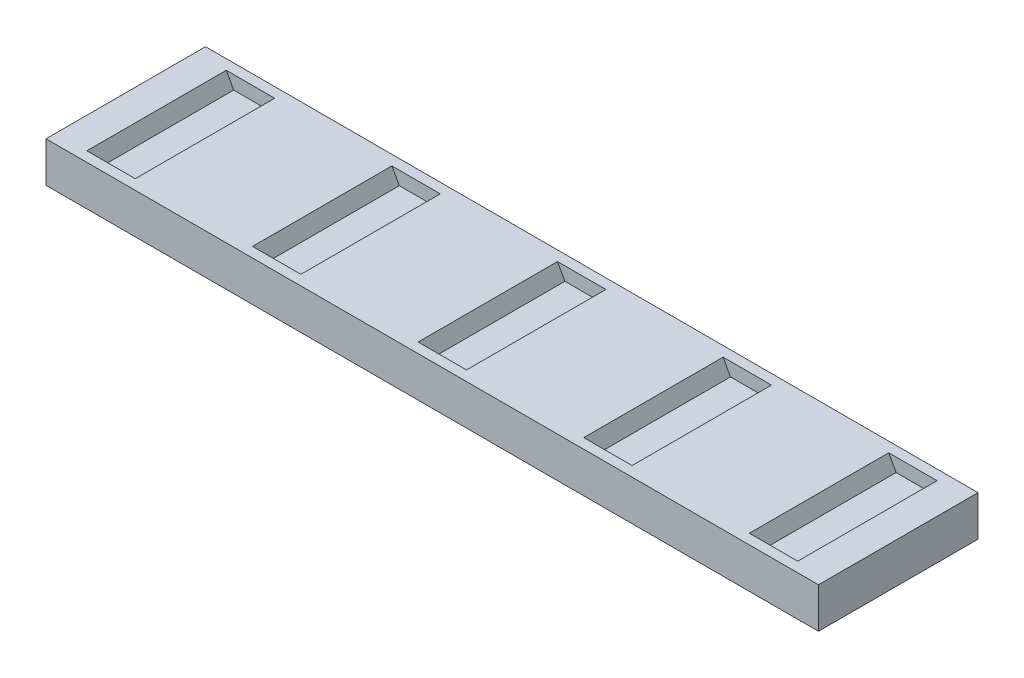
ISO-10303-21;
HEADER;
FILE_DESCRIPTION(('STEP AP214'),'2;1');
FILE_NAME('part.step','',(''),(''),'','','');
FILE_SCHEMA(('AUTOMOTIVE_DESIGN { 1 0 10303 214 1 1 1 1 }'));
ENDSEC;
DATA;
#1=APPLICATION_CONTEXT('core data for automotive mechanical design processes');
#2=APPLICATION_PROTOCOL_DEFINITION('international standard','automotive_design',2000,#1);
#3=PRODUCT_CONTEXT('',#1,'mechanical');
#4=PRODUCT('Part','Part','',(#3));
#5=PRODUCT_RELATED_PRODUCT_CATEGORY('part','',(#4));
#6=PRODUCT_DEFINITION_FORMATION('','',#4);
#7=PRODUCT_DEFINITION_CONTEXT('part definition',#1,'design');
#8=PRODUCT_DEFINITION('design','',#6,#7);
#9=PRODUCT_DEFINITION_SHAPE('','',#8);
#10=(LENGTH_UNIT() NAMED_UNIT(*) SI_UNIT(.MILLI.,.METRE.));
#11=(NAMED_UNIT(*) PLANE_ANGLE_UNIT() SI_UNIT($,.RADIAN.));
#12=(NAMED_UNIT(*) SI_UNIT($,.STERADIAN.) SOLID_ANGLE_UNIT());
#13=UNCERTAINTY_MEASURE_WITH_UNIT(LENGTH_MEASURE(1.E-05),#10,'distance_accuracy_value','');
#14=(GEOMETRIC_REPRESENTATION_CONTEXT(3) GLOBAL_UNCERTAINTY_ASSIGNED_CONTEXT((#13)) GLOBAL_UNIT_ASSIGNED_CONTEXT((#10,
#11,#12)) REPRESENTATION_CONTEXT('',''));
#15=CARTESIAN_POINT('',(0.,0.,0.));
#16=DIRECTION('',(0.,0.,1.));
#17=DIRECTION('',(1.,0.,0.));
#18=AXIS2_PLACEMENT_3D('',#15,#16,#17);
#19=CARTESIAN_POINT('',(230.,-15.,20.75));
#20=DIRECTION('',(1.,0.,0.));
#21=DIRECTION('',(0.,0.,1.));
#22=AXIS2_PLACEMENT_3D('',#19,#20,#21);
#23=PLANE('',#22);
#24=DIRECTION('',(0.,0.,1.));
#25=VECTOR('',#24,1.);
#26=CARTESIAN_POINT('',(230.,-6.,-23.75));
#27=LINE('',#26,#25);
#28=CARTESIAN_POINT('',(230.,-6.,-23.75));
#29=VERTEX_POINT('',#28);
#30=CARTESIAN_POINT('',(230.,-6.,23.75));
#31=VERTEX_POINT('',#30);
#32=EDGE_CURVE('E315',#29,#31,#27,.T.);
#33=ORIENTED_EDGE('',*,*,#32,.T.);
#34=DIRECTION('',(0.,-1.,0.));
#35=VECTOR('',#34,1.);
#36=CARTESIAN_POINT('',(230.,-15.,23.75));
#37=LINE('',#36,#35);
#38=CARTESIAN_POINT('',(230.,-18.,23.7500000000001));
#39=VERTEX_POINT('',#38);
#40=EDGE_CURVE('E338',#31,#39,#37,.T.);
#41=ORIENTED_EDGE('',*,*,#40,.T.);
#42=DIRECTION('',(0.,0.,1.));
#43=VECTOR('',#42,1.);
#44=CARTESIAN_POINT('',(230.,-18.,-23.75));
#45=LINE('',#44,#43);
#46=CARTESIAN_POINT('',(230.,-18.,-23.75));
#47=VERTEX_POINT('',#46);
#48=EDGE_CURVE('E318',#47,#39,#45,.T.);
#49=ORIENTED_EDGE('',*,*,#48,.F.);
#50=DIRECTION('',(0.,1.,0.));
#51=VECTOR('',#50,1.);
#52=CARTESIAN_POINT('',(230.,-18.,-23.75));
#53=LINE('',#52,#51);
#54=EDGE_CURVE('E329',#47,#29,#53,.T.);
#55=ORIENTED_EDGE('',*,*,#54,.T.);
#56=EDGE_LOOP('',(#33,#41,#49,#55));
#57=FACE_BOUND('',#56,.T.);
#58=ADVANCED_FACE('F37',(#57),#23,.T.);
#59=CARTESIAN_POINT('',(0.,-2.97600000000012,20.75));
#60=DIRECTION('',(-1.,0.,0.));
#61=DIRECTION('',(0.,-1.,0.));
#62=AXIS2_PLACEMENT_3D('',#59,#60,#61);
#63=PLANE('',#62);
#64=DIRECTION('',(0.,0.,1.));
#65=VECTOR('',#64,1.);
#66=CARTESIAN_POINT('',(0.,-6.,-23.75));
#67=LINE('',#66,#65);
#68=CARTESIAN_POINT('',(0.,-6.,-23.75));
#69=VERTEX_POINT('',#68);
#70=CARTESIAN_POINT('',(0.,-6.,23.75));
#71=VERTEX_POINT('',#70);
#72=EDGE_CURVE('E313',#69,#71,#67,.T.);
#73=ORIENTED_EDGE('',*,*,#72,.F.);
#74=DIRECTION('',(0.,1.,0.));
#75=VECTOR('',#74,1.);
#76=CARTESIAN_POINT('',(0.,-18.,-23.75));
#77=LINE('',#76,#75);
#78=CARTESIAN_POINT('',(0.,-18.,-23.75));
#79=VERTEX_POINT('',#78);
#80=EDGE_CURVE('E332',#79,#69,#77,.T.);
#81=ORIENTED_EDGE('',*,*,#80,.F.);
#82=DIRECTION('',(0.,0.,-1.));
#83=VECTOR('',#82,1.);
#84=CARTESIAN_POINT('',(0.,-18.,-23.75));
#85=LINE('',#84,#83);
#86=CARTESIAN_POINT('',(0.,-18.,23.75));
#87=VERTEX_POINT('',#86);
#88=EDGE_CURVE('E325',#87,#79,#85,.T.);
#89=ORIENTED_EDGE('',*,*,#88,.F.);
#90=DIRECTION('',(0.,1.,0.));
#91=VECTOR('',#90,1.);
#92=CARTESIAN_POINT('',(0.,-15.,23.75));
#93=LINE('',#92,#91);
#94=EDGE_CURVE('E335',#87,#71,#93,.T.);
#95=ORIENTED_EDGE('',*,*,#94,.T.);
#96=EDGE_LOOP('',(#73,#81,#89,#95));
#97=FACE_BOUND('',#96,.T.);
#98=ADVANCED_FACE('F408',(#97),#63,.T.);
#99=CARTESIAN_POINT('',(0.,0.,23.75));
#100=DIRECTION('',(0.,0.,1.));
#101=DIRECTION('',(-1.,0.,0.));
#102=AXIS2_PLACEMENT_3D('',#99,#100,#101);
#103=PLANE('',#102);
#104=DIRECTION('',(1.,0.,0.));
#105=VECTOR('',#104,1.);
#106=CARTESIAN_POINT('',(0.,-6.,23.75));
#107=LINE('',#106,#105);
#108=EDGE_CURVE('E226',#71,#31,#107,.T.);
#109=ORIENTED_EDGE('',*,*,#108,.F.);
#110=ORIENTED_EDGE('',*,*,#94,.F.);
#111=DIRECTION('',(-1.,0.,0.));
#112=VECTOR('',#111,1.);
#113=CARTESIAN_POINT('',(230.,-18.,23.7500000000001));
#114=LINE('',#113,#112);
#115=EDGE_CURVE('E322',#39,#87,#114,.T.);
#116=ORIENTED_EDGE('',*,*,#115,.F.);
#117=ORIENTED_EDGE('',*,*,#40,.F.);
#118=EDGE_LOOP('',(#109,#110,#116,#117));
#119=FACE_BOUND('',#118,.T.);
#120=ADVANCED_FACE('F413',(#119),#103,.T.);
#121=CARTESIAN_POINT('',(0.,-18.,0.));
#122=DIRECTION('',(0.,-1.,0.));
#123=DIRECTION('',(1.,0.,0.));
#124=AXIS2_PLACEMENT_3D('',#121,#122,#123);
#125=PLANE('',#124);
#126=ORIENTED_EDGE('',*,*,#88,.T.);
#127=DIRECTION('',(1.,0.,0.));
#128=VECTOR('',#127,1.);
#129=CARTESIAN_POINT('',(230.,-18.,-23.75));
#130=LINE('',#129,#128);
#131=EDGE_CURVE('E327',#79,#47,#130,.T.);
#132=ORIENTED_EDGE('',*,*,#131,.T.);
#133=ORIENTED_EDGE('',*,*,#48,.T.);
#134=ORIENTED_EDGE('',*,*,#115,.T.);
#135=EDGE_LOOP('',(#126,#132,#133,#134));
#136=FACE_BOUND('',#135,.T.);
#137=ADVANCED_FACE('F424',(#136),#125,.T.);
#138=CARTESIAN_POINT('',(230.,-18.,-23.75));
#139=DIRECTION('',(0.,0.,1.));
#140=DIRECTION('',(1.,0.,0.));
#141=AXIS2_PLACEMENT_3D('',#138,#139,#140);
#142=PLANE('',#141);
#143=ORIENTED_EDGE('',*,*,#80,.T.);
#144=DIRECTION('',(1.,0.,0.));
#145=VECTOR('',#144,1.);
#146=CARTESIAN_POINT('',(0.,-6.,-23.75));
#147=LINE('',#146,#145);
#148=EDGE_CURVE('E310',#69,#29,#147,.T.);
#149=ORIENTED_EDGE('',*,*,#148,.T.);
#150=ORIENTED_EDGE('',*,*,#54,.F.);
#151=ORIENTED_EDGE('',*,*,#131,.F.);
#152=EDGE_LOOP('',(#143,#149,#150,#151));
#153=FACE_BOUND('',#152,.T.);
#154=ADVANCED_FACE('F429',(#153),#142,.F.);
#155=CARTESIAN_POINT('',(0.,-6.,-23.75));
#156=DIRECTION('',(0.,-1.,0.));
#157=DIRECTION('',(0.,0.,-1.));
#158=AXIS2_PLACEMENT_3D('',#155,#156,#157);
#159=PLANE('',#158);
#160=DIRECTION('',(0.,0.,-1.));
#161=VECTOR('',#160,1.);
#162=CARTESIAN_POINT('',(9.18000000000008,-6.,-23.75));
#163=LINE('',#162,#161);
#164=CARTESIAN_POINT('',(9.18000000000008,-6.,20.75));
#165=VERTEX_POINT('',#164);
#166=CARTESIAN_POINT('',(9.18000000000008,-6.,-20.75));
#167=VERTEX_POINT('',#166);
#168=EDGE_CURVE('E44',#165,#167,#163,.T.);
#169=ORIENTED_EDGE('',*,*,#168,.T.);
#170=DIRECTION('',(1.,0.,0.));
#171=VECTOR('',#170,1.);
#172=CARTESIAN_POINT('',(0.,-6.,-20.75));
#173=LINE('',#172,#171);
#174=CARTESIAN_POINT('',(23.58,-6.,-20.75));
#175=VERTEX_POINT('',#174);
#176=EDGE_CURVE('E12',#167,#175,#173,.T.);
#177=ORIENTED_EDGE('',*,*,#176,.T.);
#178=DIRECTION('',(0.,0.,1.));
#179=VECTOR('',#178,1.);
#180=CARTESIAN_POINT('',(23.58,-6.,-23.75));
#181=LINE('',#180,#179);
#182=CARTESIAN_POINT('',(23.58,-6.,20.75));
#183=VERTEX_POINT('',#182);
#184=EDGE_CURVE('E386',#175,#183,#181,.T.);
#185=ORIENTED_EDGE('',*,*,#184,.T.);
#186=DIRECTION('',(1.,0.,0.));
#187=VECTOR('',#186,1.);
#188=CARTESIAN_POINT('',(0.,-6.,20.75));
#189=LINE('',#188,#187);
#190=EDGE_CURVE('E384',#165,#183,#189,.T.);
#191=ORIENTED_EDGE('',*,*,#190,.F.);
#192=EDGE_LOOP('',(#169,#177,#185,#191));
#193=FACE_BOUND('',#192,.T.);
#194=DIRECTION('',(0.,0.,-1.));
#195=VECTOR('',#194,1.);
#196=CARTESIAN_POINT('',(58.4900000000001,-6.,-23.75));
#197=LINE('',#196,#195);
#198=CARTESIAN_POINT('',(58.4900000000001,-6.,20.75));
#199=VERTEX_POINT('',#198);
#200=CARTESIAN_POINT('',(58.4900000000001,-6.,-20.75));
#201=VERTEX_POINT('',#200);
#202=EDGE_CURVE('E378',#199,#201,#197,.T.);
#203=ORIENTED_EDGE('',*,*,#202,.T.);
#204=DIRECTION('',(1.,0.,0.));
#205=VECTOR('',#204,1.);
#206=CARTESIAN_POINT('',(0.,-6.,-20.75));
#207=LINE('',#206,#205);
#208=CARTESIAN_POINT('',(72.8900000000001,-6.,-20.75));
#209=VERTEX_POINT('',#208);
#210=EDGE_CURVE('E381',#201,#209,#207,.T.);
#211=ORIENTED_EDGE('',*,*,#210,.T.);
#212=DIRECTION('',(0.,0.,1.));
#213=VECTOR('',#212,1.);
#214=CARTESIAN_POINT('',(72.8900000000001,-6.,-23.75));
#215=LINE('',#214,#213);
#216=CARTESIAN_POINT('',(72.8900000000001,-6.,20.75));
#217=VERTEX_POINT('',#216);
#218=EDGE_CURVE('E375',#209,#217,#215,.T.);
#219=ORIENTED_EDGE('',*,*,#218,.T.);
#220=DIRECTION('',(1.,0.,0.));
#221=VECTOR('',#220,1.);
#222=CARTESIAN_POINT('',(0.,-6.,20.75));
#223=LINE('',#222,#221);
#224=EDGE_CURVE('E373',#199,#217,#223,.T.);
#225=ORIENTED_EDGE('',*,*,#224,.F.);
#226=EDGE_LOOP('',(#203,#211,#219,#225));
#227=FACE_BOUND('',#226,.T.);
#228=DIRECTION('',(0.,0.,-1.));
#229=VECTOR('',#228,1.);
#230=CARTESIAN_POINT('',(107.8,-6.,-23.75));
#231=LINE('',#230,#229);
#232=CARTESIAN_POINT('',(107.8,-6.,20.75));
#233=VERTEX_POINT('',#232);
#234=CARTESIAN_POINT('',(107.8,-6.,-20.75));
#235=VERTEX_POINT('',#234);
#236=EDGE_CURVE('E367',#233,#235,#231,.T.);
#237=ORIENTED_EDGE('',*,*,#236,.T.);
#238=DIRECTION('',(1.,0.,0.));
#239=VECTOR('',#238,1.);
#240=CARTESIAN_POINT('',(0.,-6.,-20.75));
#241=LINE('',#240,#239);
#242=CARTESIAN_POINT('',(122.2,-6.,-20.75));
#243=VERTEX_POINT('',#242);
#244=EDGE_CURVE('E370',#235,#243,#241,.T.);
#245=ORIENTED_EDGE('',*,*,#244,.T.);
#246=DIRECTION('',(0.,0.,1.));
#247=VECTOR('',#246,1.);
#248=CARTESIAN_POINT('',(122.2,-6.,-23.75));
#249=LINE('',#248,#247);
#250=CARTESIAN_POINT('',(122.2,-6.,20.75));
#251=VERTEX_POINT('',#250);
#252=EDGE_CURVE('E364',#243,#251,#249,.T.);
#253=ORIENTED_EDGE('',*,*,#252,.T.);
#254=DIRECTION('',(1.,0.,0.));
#255=VECTOR('',#254,1.);
#256=CARTESIAN_POINT('',(0.,-6.,20.75));
#257=LINE('',#256,#255);
#258=EDGE_CURVE('E362',#233,#251,#257,.T.);
#259=ORIENTED_EDGE('',*,*,#258,.F.);
#260=EDGE_LOOP('',(#237,#245,#253,#259));
#261=FACE_BOUND('',#260,.T.);
#262=DIRECTION('',(0.,0.,-1.));
#263=VECTOR('',#262,1.);
#264=CARTESIAN_POINT('',(157.11,-6.,-23.75));
#265=LINE('',#264,#263);
#266=CARTESIAN_POINT('',(157.11,-6.,20.75));
#267=VERTEX_POINT('',#266);
#268=CARTESIAN_POINT('',(157.11,-6.,-20.75));
#269=VERTEX_POINT('',#268);
#270=EDGE_CURVE('E356',#267,#269,#265,.T.);
#271=ORIENTED_EDGE('',*,*,#270,.T.);
#272=DIRECTION('',(1.,0.,0.));
#273=VECTOR('',#272,1.);
#274=CARTESIAN_POINT('',(0.,-6.,-20.75));
#275=LINE('',#274,#273);
#276=CARTESIAN_POINT('',(171.51,-6.,-20.75));
#277=VERTEX_POINT('',#276);
#278=EDGE_CURVE('E359',#269,#277,#275,.T.);
#279=ORIENTED_EDGE('',*,*,#278,.T.);
#280=DIRECTION('',(0.,0.,1.));
#281=VECTOR('',#280,1.);
#282=CARTESIAN_POINT('',(171.51,-6.,-23.75));
#283=LINE('',#282,#281);
#284=CARTESIAN_POINT('',(171.51,-6.,20.75));
#285=VERTEX_POINT('',#284);
#286=EDGE_CURVE('E353',#277,#285,#283,.T.);
#287=ORIENTED_EDGE('',*,*,#286,.T.);
#288=DIRECTION('',(1.,0.,0.));
#289=VECTOR('',#288,1.);
#290=CARTESIAN_POINT('',(0.,-6.,20.75));
#291=LINE('',#290,#289);
#292=EDGE_CURVE('E351',#267,#285,#291,.T.);
#293=ORIENTED_EDGE('',*,*,#292,.F.);
#294=EDGE_LOOP('',(#271,#279,#287,#293));
#295=FACE_BOUND('',#294,.T.);
#296=DIRECTION('',(0.,0.,-1.));
#297=VECTOR('',#296,1.);
#298=CARTESIAN_POINT('',(206.42,-6.,-23.75));
#299=LINE('',#298,#297);
#300=CARTESIAN_POINT('',(206.42,-6.,20.75));
#301=VERTEX_POINT('',#300);
#302=CARTESIAN_POINT('',(206.42,-6.,-20.75));
#303=VERTEX_POINT('',#302);
#304=EDGE_CURVE('E345',#301,#303,#299,.T.);
#305=ORIENTED_EDGE('',*,*,#304,.T.);
#306=DIRECTION('',(1.,0.,0.));
#307=VECTOR('',#306,1.);
#308=CARTESIAN_POINT('',(0.,-6.,-20.75));
#309=LINE('',#308,#307);
#310=CARTESIAN_POINT('',(220.82,-6.,-20.75));
#311=VERTEX_POINT('',#310);
#312=EDGE_CURVE('E348',#303,#311,#309,.T.);
#313=ORIENTED_EDGE('',*,*,#312,.T.);
#314=DIRECTION('',(0.,0.,1.));
#315=VECTOR('',#314,1.);
#316=CARTESIAN_POINT('',(220.82,-6.,-23.75));
#317=LINE('',#316,#315);
#318=CARTESIAN_POINT('',(220.82,-6.,20.75));
#319=VERTEX_POINT('',#318);
#320=EDGE_CURVE('E342',#311,#319,#317,.T.);
#321=ORIENTED_EDGE('',*,*,#320,.T.);
#322=DIRECTION('',(1.,0.,0.));
#323=VECTOR('',#322,1.);
#324=CARTESIAN_POINT('',(0.,-6.,20.75));
#325=LINE('',#324,#323);
#326=EDGE_CURVE('E340',#301,#319,#325,.T.);
#327=ORIENTED_EDGE('',*,*,#326,.F.);
#328=EDGE_LOOP('',(#305,#313,#321,#327));
#329=FACE_BOUND('',#328,.T.);
#330=ORIENTED_EDGE('',*,*,#108,.T.);
#331=ORIENTED_EDGE('',*,*,#32,.F.);
#332=ORIENTED_EDGE('',*,*,#148,.F.);
#333=ORIENTED_EDGE('',*,*,#72,.T.);
#334=EDGE_LOOP('',(#330,#331,#332,#333));
#335=FACE_BOUND('',#334,.T.);
#336=ADVANCED_FACE('F390',(#193,#227,#261,#295,#329,#335),#159,.F.);
#337=CARTESIAN_POINT('',(208.62,-9.99999999999997,-20.75));
#338=DIRECTION('',(-0.876215908676647,-0.481918749772156,0.));
#339=DIRECTION('',(0.481918749772156,-0.876215908676647,0.));
#340=AXIS2_PLACEMENT_3D('',#337,#338,#339);
#341=PLANE('',#340);
#342=DIRECTION('',(0.481918749772156,-0.876215908676647,0.));
#343=VECTOR('',#342,1.);
#344=CARTESIAN_POINT('',(208.62,-9.99999999999997,20.75));
#345=LINE('',#344,#343);
#346=CARTESIAN_POINT('',(208.62,-9.99999999999997,20.75));
#347=VERTEX_POINT('',#346);
#348=EDGE_CURVE('E300',#301,#347,#345,.T.);
#349=ORIENTED_EDGE('',*,*,#348,.T.);
#350=DIRECTION('',(0.,0.,1.));
#351=VECTOR('',#350,1.);
#352=CARTESIAN_POINT('',(208.62,-9.99999999999997,-20.75));
#353=LINE('',#352,#351);
#354=CARTESIAN_POINT('',(208.62,-9.99999999999997,-20.75));
#355=VERTEX_POINT('',#354);
#356=EDGE_CURVE('E299',#355,#347,#353,.T.);
#357=ORIENTED_EDGE('',*,*,#356,.F.);
#358=DIRECTION('',(0.481918749772156,-0.876215908676647,0.));
#359=VECTOR('',#358,1.);
#360=CARTESIAN_POINT('',(208.62,-9.99999999999997,-20.75));
#361=LINE('',#360,#359);
#362=EDGE_CURVE('E290',#303,#355,#361,.T.);
#363=ORIENTED_EDGE('',*,*,#362,.F.);
#364=ORIENTED_EDGE('',*,*,#304,.F.);
#365=EDGE_LOOP('',(#349,#357,#363,#364));
#366=FACE_BOUND('',#365,.T.);
#367=ADVANCED_FACE('F431',(#366),#341,.F.);
#368=CARTESIAN_POINT('',(224.12,0.,-20.75));
#369=DIRECTION('',(0.876215908676647,-0.481918749772156,0.));
#370=DIRECTION('',(0.481918749772156,0.876215908676647,0.));
#371=AXIS2_PLACEMENT_3D('',#368,#369,#370);
#372=PLANE('',#371);
#373=DIRECTION('',(0.481918749772156,0.876215908676647,0.));
#374=VECTOR('',#373,1.);
#375=CARTESIAN_POINT('',(224.12,0.,-20.75));
#376=LINE('',#375,#374);
#377=CARTESIAN_POINT('',(218.62,-9.99999999999997,-20.75));
#378=VERTEX_POINT('',#377);
#379=EDGE_CURVE('E296',#378,#311,#376,.T.);
#380=ORIENTED_EDGE('',*,*,#379,.F.);
#381=DIRECTION('',(0.,0.,1.));
#382=VECTOR('',#381,1.);
#383=CARTESIAN_POINT('',(218.62,-9.99999999999997,-20.75));
#384=LINE('',#383,#382);
#385=CARTESIAN_POINT('',(218.62,-9.99999999999997,20.75));
#386=VERTEX_POINT('',#385);
#387=EDGE_CURVE('E282',#378,#386,#384,.T.);
#388=ORIENTED_EDGE('',*,*,#387,.T.);
#389=DIRECTION('',(0.481918749772156,0.876215908676647,0.));
#390=VECTOR('',#389,1.);
#391=CARTESIAN_POINT('',(224.12,0.,20.75));
#392=LINE('',#391,#390);
#393=EDGE_CURVE('E293',#386,#319,#392,.T.);
#394=ORIENTED_EDGE('',*,*,#393,.T.);
#395=ORIENTED_EDGE('',*,*,#320,.F.);
#396=EDGE_LOOP('',(#380,#388,#394,#395));
#397=FACE_BOUND('',#396,.T.);
#398=ADVANCED_FACE('F437',(#397),#372,.F.);
#399=CARTESIAN_POINT('',(0.,0.,-20.75));
#400=DIRECTION('',(0.,0.,-1.));
#401=DIRECTION('',(-1.,0.,0.));
#402=AXIS2_PLACEMENT_3D('',#399,#400,#401);
#403=PLANE('',#402);
#404=ORIENTED_EDGE('',*,*,#362,.T.);
#405=DIRECTION('',(1.,0.,0.));
#406=VECTOR('',#405,1.);
#407=CARTESIAN_POINT('',(218.62,-9.99999999999997,-20.75));
#408=LINE('',#407,#406);
#409=EDGE_CURVE('E292',#355,#378,#408,.T.);
#410=ORIENTED_EDGE('',*,*,#409,.T.);
#411=ORIENTED_EDGE('',*,*,#379,.T.);
#412=ORIENTED_EDGE('',*,*,#312,.F.);
#413=EDGE_LOOP('',(#404,#410,#411,#412));
#414=FACE_BOUND('',#413,.T.);
#415=ADVANCED_FACE('F479',(#414),#403,.F.);
#416=CARTESIAN_POINT('',(0.,0.,20.75));
#417=DIRECTION('',(0.,0.,-1.));
#418=DIRECTION('',(-1.,0.,0.));
#419=AXIS2_PLACEMENT_3D('',#416,#417,#418);
#420=PLANE('',#419);
#421=ORIENTED_EDGE('',*,*,#326,.T.);
#422=ORIENTED_EDGE('',*,*,#393,.F.);
#423=DIRECTION('',(1.,0.,0.));
#424=VECTOR('',#423,1.);
#425=CARTESIAN_POINT('',(218.62,-9.99999999999997,20.75));
#426=LINE('',#425,#424);
#427=EDGE_CURVE('E302',#347,#386,#426,.T.);
#428=ORIENTED_EDGE('',*,*,#427,.F.);
#429=ORIENTED_EDGE('',*,*,#348,.F.);
#430=EDGE_LOOP('',(#421,#422,#428,#429));
#431=FACE_BOUND('',#430,.T.);
#432=ADVANCED_FACE('F489',(#431),#420,.T.);
#433=CARTESIAN_POINT('',(218.62,-9.99999999999997,-20.75));
#434=DIRECTION('',(0.,-1.,0.));
#435=DIRECTION('',(0.,0.,-1.));
#436=AXIS2_PLACEMENT_3D('',#433,#434,#435);
#437=PLANE('',#436);
#438=ORIENTED_EDGE('',*,*,#427,.T.);
#439=ORIENTED_EDGE('',*,*,#387,.F.);
#440=ORIENTED_EDGE('',*,*,#409,.F.);
#441=ORIENTED_EDGE('',*,*,#356,.T.);
#442=EDGE_LOOP('',(#438,#439,#440,#441));
#443=FACE_BOUND('',#442,.T.);
#444=ADVANCED_FACE('F499',(#443),#437,.F.);
#445=CARTESIAN_POINT('',(159.31,-9.99999999999997,-20.75));
#446=DIRECTION('',(-0.876215908676647,-0.481918749772156,0.));
#447=DIRECTION('',(0.481918749772156,-0.876215908676647,0.));
#448=AXIS2_PLACEMENT_3D('',#445,#446,#447);
#449=PLANE('',#448);
#450=DIRECTION('',(0.481918749772156,-0.876215908676647,0.));
#451=VECTOR('',#450,1.);
#452=CARTESIAN_POINT('',(159.31,-9.99999999999997,20.75));
#453=LINE('',#452,#451);
#454=CARTESIAN_POINT('',(159.31,-9.99999999999997,20.75));
#455=VERTEX_POINT('',#454);
#456=EDGE_CURVE('E279',#267,#455,#453,.T.);
#457=ORIENTED_EDGE('',*,*,#456,.T.);
#458=DIRECTION('',(0.,0.,1.));
#459=VECTOR('',#458,1.);
#460=CARTESIAN_POINT('',(159.31,-9.99999999999997,-20.75));
#461=LINE('',#460,#459);
#462=CARTESIAN_POINT('',(159.31,-9.99999999999997,-20.75));
#463=VERTEX_POINT('',#462);
#464=EDGE_CURVE('E278',#463,#455,#461,.T.);
#465=ORIENTED_EDGE('',*,*,#464,.F.);
#466=DIRECTION('',(0.481918749772156,-0.876215908676647,0.));
#467=VECTOR('',#466,1.);
#468=CARTESIAN_POINT('',(159.31,-9.99999999999997,-20.75));
#469=LINE('',#468,#467);
#470=EDGE_CURVE('E269',#269,#463,#469,.T.);
#471=ORIENTED_EDGE('',*,*,#470,.F.);
#472=ORIENTED_EDGE('',*,*,#270,.F.);
#473=EDGE_LOOP('',(#457,#465,#471,#472));
#474=FACE_BOUND('',#473,.T.);
#475=ADVANCED_FACE('F509',(#474),#449,.F.);
#476=CARTESIAN_POINT('',(174.81,0.,-20.75));
#477=DIRECTION('',(0.876215908676647,-0.481918749772156,0.));
#478=DIRECTION('',(0.481918749772156,0.876215908676647,0.));
#479=AXIS2_PLACEMENT_3D('',#476,#477,#478);
#480=PLANE('',#479);
#481=DIRECTION('',(0.481918749772156,0.876215908676647,0.));
#482=VECTOR('',#481,1.);
#483=CARTESIAN_POINT('',(174.81,0.,-20.75));
#484=LINE('',#483,#482);
#485=CARTESIAN_POINT('',(169.31,-9.99999999999997,-20.75));
#486=VERTEX_POINT('',#485);
#487=EDGE_CURVE('E275',#486,#277,#484,.T.);
#488=ORIENTED_EDGE('',*,*,#487,.F.);
#489=DIRECTION('',(0.,0.,1.));
#490=VECTOR('',#489,1.);
#491=CARTESIAN_POINT('',(169.31,-9.99999999999997,-20.75));
#492=LINE('',#491,#490);
#493=CARTESIAN_POINT('',(169.31,-9.99999999999997,20.75));
#494=VERTEX_POINT('',#493);
#495=EDGE_CURVE('E261',#486,#494,#492,.T.);
#496=ORIENTED_EDGE('',*,*,#495,.T.);
#497=DIRECTION('',(0.481918749772156,0.876215908676647,0.));
#498=VECTOR('',#497,1.);
#499=CARTESIAN_POINT('',(174.81,0.,20.75));
#500=LINE('',#499,#498);
#501=EDGE_CURVE('E272',#494,#285,#500,.T.);
#502=ORIENTED_EDGE('',*,*,#501,.T.);
#503=ORIENTED_EDGE('',*,*,#286,.F.);
#504=EDGE_LOOP('',(#488,#496,#502,#503));
#505=FACE_BOUND('',#504,.T.);
#506=ADVANCED_FACE('F518',(#505),#480,.F.);
#507=CARTESIAN_POINT('',(0.,0.,-20.75));
#508=DIRECTION('',(0.,0.,-1.));
#509=DIRECTION('',(-1.,0.,0.));
#510=AXIS2_PLACEMENT_3D('',#507,#508,#509);
#511=PLANE('',#510);
#512=ORIENTED_EDGE('',*,*,#470,.T.);
#513=DIRECTION('',(1.,0.,0.));
#514=VECTOR('',#513,1.);
#515=CARTESIAN_POINT('',(169.31,-9.99999999999997,-20.75));
#516=LINE('',#515,#514);
#517=EDGE_CURVE('E271',#463,#486,#516,.T.);
#518=ORIENTED_EDGE('',*,*,#517,.T.);
#519=ORIENTED_EDGE('',*,*,#487,.T.);
#520=ORIENTED_EDGE('',*,*,#278,.F.);
#521=EDGE_LOOP('',(#512,#518,#519,#520));
#522=FACE_BOUND('',#521,.T.);
#523=ADVANCED_FACE('F528',(#522),#511,.F.);
#524=CARTESIAN_POINT('',(0.,0.,20.75));
#525=DIRECTION('',(0.,0.,-1.));
#526=DIRECTION('',(-1.,0.,0.));
#527=AXIS2_PLACEMENT_3D('',#524,#525,#526);
#528=PLANE('',#527);
#529=ORIENTED_EDGE('',*,*,#292,.T.);
#530=ORIENTED_EDGE('',*,*,#501,.F.);
#531=DIRECTION('',(1.,0.,0.));
#532=VECTOR('',#531,1.);
#533=CARTESIAN_POINT('',(169.31,-9.99999999999997,20.75));
#534=LINE('',#533,#532);
#535=EDGE_CURVE('E281',#455,#494,#534,.T.);
#536=ORIENTED_EDGE('',*,*,#535,.F.);
#537=ORIENTED_EDGE('',*,*,#456,.F.);
#538=EDGE_LOOP('',(#529,#530,#536,#537));
#539=FACE_BOUND('',#538,.T.);
#540=ADVANCED_FACE('F538',(#539),#528,.T.);
#541=CARTESIAN_POINT('',(169.31,-9.99999999999997,-20.75));
#542=DIRECTION('',(0.,-1.,0.));
#543=DIRECTION('',(0.,0.,-1.));
#544=AXIS2_PLACEMENT_3D('',#541,#542,#543);
#545=PLANE('',#544);
#546=ORIENTED_EDGE('',*,*,#535,.T.);
#547=ORIENTED_EDGE('',*,*,#495,.F.);
#548=ORIENTED_EDGE('',*,*,#517,.F.);
#549=ORIENTED_EDGE('',*,*,#464,.T.);
#550=EDGE_LOOP('',(#546,#547,#548,#549));
#551=FACE_BOUND('',#550,.T.);
#552=ADVANCED_FACE('F548',(#551),#545,.F.);
#553=CARTESIAN_POINT('',(110.,-9.99999999999997,-20.75));
#554=DIRECTION('',(-0.876215908676647,-0.481918749772155,0.));
#555=DIRECTION('',(0.481918749772155,-0.876215908676647,0.));
#556=AXIS2_PLACEMENT_3D('',#553,#554,#555);
#557=PLANE('',#556);
#558=DIRECTION('',(0.481918749772155,-0.876215908676647,0.));
#559=VECTOR('',#558,1.);
#560=CARTESIAN_POINT('',(110.,-9.99999999999997,20.75));
#561=LINE('',#560,#559);
#562=CARTESIAN_POINT('',(110.,-9.99999999999997,20.75));
#563=VERTEX_POINT('',#562);
#564=EDGE_CURVE('E258',#233,#563,#561,.T.);
#565=ORIENTED_EDGE('',*,*,#564,.T.);
#566=DIRECTION('',(0.,0.,1.));
#567=VECTOR('',#566,1.);
#568=CARTESIAN_POINT('',(110.,-9.99999999999997,-20.75));
#569=LINE('',#568,#567);
#570=CARTESIAN_POINT('',(110.,-9.99999999999997,-20.75));
#571=VERTEX_POINT('',#570);
#572=EDGE_CURVE('E257',#571,#563,#569,.T.);
#573=ORIENTED_EDGE('',*,*,#572,.F.);
#574=DIRECTION('',(0.481918749772155,-0.876215908676647,0.));
#575=VECTOR('',#574,1.);
#576=CARTESIAN_POINT('',(110.,-9.99999999999997,-20.75));
#577=LINE('',#576,#575);
#578=EDGE_CURVE('E248',#235,#571,#577,.T.);
#579=ORIENTED_EDGE('',*,*,#578,.F.);
#580=ORIENTED_EDGE('',*,*,#236,.F.);
#581=EDGE_LOOP('',(#565,#573,#579,#580));
#582=FACE_BOUND('',#581,.T.);
#583=ADVANCED_FACE('F558',(#582),#557,.F.);
#584=CARTESIAN_POINT('',(125.5,0.,-20.75));
#585=DIRECTION('',(0.876215908676647,-0.481918749772156,0.));
#586=DIRECTION('',(0.481918749772156,0.876215908676647,0.));
#587=AXIS2_PLACEMENT_3D('',#584,#585,#586);
#588=PLANE('',#587);
#589=DIRECTION('',(0.481918749772156,0.876215908676647,0.));
#590=VECTOR('',#589,1.);
#591=CARTESIAN_POINT('',(125.5,0.,-20.75));
#592=LINE('',#591,#590);
#593=CARTESIAN_POINT('',(120.,-9.99999999999997,-20.75));
#594=VERTEX_POINT('',#593);
#595=EDGE_CURVE('E254',#594,#243,#592,.T.);
#596=ORIENTED_EDGE('',*,*,#595,.F.);
#597=DIRECTION('',(0.,0.,1.));
#598=VECTOR('',#597,1.);
#599=CARTESIAN_POINT('',(120.,-9.99999999999997,-20.75));
#600=LINE('',#599,#598);
#601=CARTESIAN_POINT('',(120.,-9.99999999999997,20.75));
#602=VERTEX_POINT('',#601);
#603=EDGE_CURVE('E240',#594,#602,#600,.T.);
#604=ORIENTED_EDGE('',*,*,#603,.T.);
#605=DIRECTION('',(0.481918749772156,0.876215908676647,0.));
#606=VECTOR('',#605,1.);
#607=CARTESIAN_POINT('',(125.5,0.,20.75));
#608=LINE('',#607,#606);
#609=EDGE_CURVE('E251',#602,#251,#608,.T.);
#610=ORIENTED_EDGE('',*,*,#609,.T.);
#611=ORIENTED_EDGE('',*,*,#252,.F.);
#612=EDGE_LOOP('',(#596,#604,#610,#611));
#613=FACE_BOUND('',#612,.T.);
#614=ADVANCED_FACE('F568',(#613),#588,.F.);
#615=CARTESIAN_POINT('',(0.,0.,-20.75));
#616=DIRECTION('',(0.,0.,-1.));
#617=DIRECTION('',(-1.,0.,0.));
#618=AXIS2_PLACEMENT_3D('',#615,#616,#617);
#619=PLANE('',#618);
#620=ORIENTED_EDGE('',*,*,#578,.T.);
#621=DIRECTION('',(1.,0.,0.));
#622=VECTOR('',#621,1.);
#623=CARTESIAN_POINT('',(120.,-9.99999999999997,-20.75));
#624=LINE('',#623,#622);
#625=EDGE_CURVE('E250',#571,#594,#624,.T.);
#626=ORIENTED_EDGE('',*,*,#625,.T.);
#627=ORIENTED_EDGE('',*,*,#595,.T.);
#628=ORIENTED_EDGE('',*,*,#244,.F.);
#629=EDGE_LOOP('',(#620,#626,#627,#628));
#630=FACE_BOUND('',#629,.T.);
#631=ADVANCED_FACE('F578',(#630),#619,.F.);
#632=CARTESIAN_POINT('',(0.,0.,20.75));
#633=DIRECTION('',(0.,0.,-1.));
#634=DIRECTION('',(-1.,0.,0.));
#635=AXIS2_PLACEMENT_3D('',#632,#633,#634);
#636=PLANE('',#635);
#637=ORIENTED_EDGE('',*,*,#258,.T.);
#638=ORIENTED_EDGE('',*,*,#609,.F.);
#639=DIRECTION('',(1.,0.,0.));
#640=VECTOR('',#639,1.);
#641=CARTESIAN_POINT('',(120.,-9.99999999999997,20.75));
#642=LINE('',#641,#640);
#643=EDGE_CURVE('E260',#563,#602,#642,.T.);
#644=ORIENTED_EDGE('',*,*,#643,.F.);
#645=ORIENTED_EDGE('',*,*,#564,.F.);
#646=EDGE_LOOP('',(#637,#638,#644,#645));
#647=FACE_BOUND('',#646,.T.);
#648=ADVANCED_FACE('F588',(#647),#636,.T.);
#649=CARTESIAN_POINT('',(120.,-9.99999999999997,-20.75));
#650=DIRECTION('',(0.,-1.,0.));
#651=DIRECTION('',(0.,0.,-1.));
#652=AXIS2_PLACEMENT_3D('',#649,#650,#651);
#653=PLANE('',#652);
#654=ORIENTED_EDGE('',*,*,#643,.T.);
#655=ORIENTED_EDGE('',*,*,#603,.F.);
#656=ORIENTED_EDGE('',*,*,#625,.F.);
#657=ORIENTED_EDGE('',*,*,#572,.T.);
#658=EDGE_LOOP('',(#654,#655,#656,#657));
#659=FACE_BOUND('',#658,.T.);
#660=ADVANCED_FACE('F598',(#659),#653,.F.);
#661=CARTESIAN_POINT('',(60.6900000000001,-9.99999999999997,-20.75));
#662=DIRECTION('',(-0.876215908676647,-0.481918749772156,0.));
#663=DIRECTION('',(0.481918749772156,-0.876215908676647,0.));
#664=AXIS2_PLACEMENT_3D('',#661,#662,#663);
#665=PLANE('',#664);
#666=DIRECTION('',(0.481918749772156,-0.876215908676647,0.));
#667=VECTOR('',#666,1.);
#668=CARTESIAN_POINT('',(60.6900000000001,-9.99999999999997,20.75));
#669=LINE('',#668,#667);
#670=CARTESIAN_POINT('',(60.6900000000001,-9.99999999999997,20.75));
#671=VERTEX_POINT('',#670);
#672=EDGE_CURVE('E59',#199,#671,#669,.T.);
#673=ORIENTED_EDGE('',*,*,#672,.T.);
#674=DIRECTION('',(0.,0.,1.));
#675=VECTOR('',#674,1.);
#676=CARTESIAN_POINT('',(60.6900000000001,-9.99999999999997,-20.75));
#677=LINE('',#676,#675);
#678=CARTESIAN_POINT('',(60.6900000000001,-9.99999999999997,-20.75));
#679=VERTEX_POINT('',#678);
#680=EDGE_CURVE('E237',#679,#671,#677,.T.);
#681=ORIENTED_EDGE('',*,*,#680,.F.);
#682=DIRECTION('',(0.481918749772156,-0.876215908676647,0.));
#683=VECTOR('',#682,1.);
#684=CARTESIAN_POINT('',(60.6900000000001,-9.99999999999997,-20.75));
#685=LINE('',#684,#683);
#686=EDGE_CURVE('E228',#201,#679,#685,.T.);
#687=ORIENTED_EDGE('',*,*,#686,.F.);
#688=ORIENTED_EDGE('',*,*,#202,.F.);
#689=EDGE_LOOP('',(#673,#681,#687,#688));
#690=FACE_BOUND('',#689,.T.);
#691=ADVANCED_FACE('F608',(#690),#665,.F.);
#692=CARTESIAN_POINT('',(76.1900000000001,0.,-20.75));
#693=DIRECTION('',(0.876215908676647,-0.481918749772155,0.));
#694=DIRECTION('',(0.481918749772155,0.876215908676647,0.));
#695=AXIS2_PLACEMENT_3D('',#692,#693,#694);
#696=PLANE('',#695);
#697=DIRECTION('',(0.481918749772155,0.876215908676647,0.));
#698=VECTOR('',#697,1.);
#699=CARTESIAN_POINT('',(76.1900000000001,0.,-20.75));
#700=LINE('',#699,#698);
#701=CARTESIAN_POINT('',(70.6900000000001,-9.99999999999997,-20.75));
#702=VERTEX_POINT('',#701);
#703=EDGE_CURVE('E234',#702,#209,#700,.T.);
#704=ORIENTED_EDGE('',*,*,#703,.F.);
#705=DIRECTION('',(0.,0.,1.));
#706=VECTOR('',#705,1.);
#707=CARTESIAN_POINT('',(70.6900000000001,-9.99999999999997,-20.75));
#708=LINE('',#707,#706);
#709=CARTESIAN_POINT('',(70.6900000000001,-9.99999999999997,20.75));
#710=VERTEX_POINT('',#709);
#711=EDGE_CURVE('E222',#702,#710,#708,.T.);
#712=ORIENTED_EDGE('',*,*,#711,.T.);
#713=DIRECTION('',(0.481918749772155,0.876215908676647,0.));
#714=VECTOR('',#713,1.);
#715=CARTESIAN_POINT('',(76.1900000000001,0.,20.75));
#716=LINE('',#715,#714);
#717=EDGE_CURVE('E231',#710,#217,#716,.T.);
#718=ORIENTED_EDGE('',*,*,#717,.T.);
#719=ORIENTED_EDGE('',*,*,#218,.F.);
#720=EDGE_LOOP('',(#704,#712,#718,#719));
#721=FACE_BOUND('',#720,.T.);
#722=ADVANCED_FACE('F618',(#721),#696,.F.);
#723=CARTESIAN_POINT('',(0.,0.,-20.75));
#724=DIRECTION('',(0.,0.,-1.));
#725=DIRECTION('',(-1.,0.,0.));
#726=AXIS2_PLACEMENT_3D('',#723,#724,#725);
#727=PLANE('',#726);
#728=ORIENTED_EDGE('',*,*,#686,.T.);
#729=DIRECTION('',(1.,0.,0.));
#730=VECTOR('',#729,1.);
#731=CARTESIAN_POINT('',(70.6900000000001,-9.99999999999997,-20.75));
#732=LINE('',#731,#730);
#733=EDGE_CURVE('E230',#679,#702,#732,.T.);
#734=ORIENTED_EDGE('',*,*,#733,.T.);
#735=ORIENTED_EDGE('',*,*,#703,.T.);
#736=ORIENTED_EDGE('',*,*,#210,.F.);
#737=EDGE_LOOP('',(#728,#734,#735,#736));
#738=FACE_BOUND('',#737,.T.);
#739=ADVANCED_FACE('F628',(#738),#727,.F.);
#740=CARTESIAN_POINT('',(0.,0.,20.75));
#741=DIRECTION('',(0.,0.,-1.));
#742=DIRECTION('',(-1.,0.,0.));
#743=AXIS2_PLACEMENT_3D('',#740,#741,#742);
#744=PLANE('',#743);
#745=ORIENTED_EDGE('',*,*,#224,.T.);
#746=ORIENTED_EDGE('',*,*,#717,.F.);
#747=DIRECTION('',(1.,0.,0.));
#748=VECTOR('',#747,1.);
#749=CARTESIAN_POINT('',(70.6900000000001,-9.99999999999997,20.75));
#750=LINE('',#749,#748);
#751=EDGE_CURVE('E239',#671,#710,#750,.T.);
#752=ORIENTED_EDGE('',*,*,#751,.F.);
#753=ORIENTED_EDGE('',*,*,#672,.F.);
#754=EDGE_LOOP('',(#745,#746,#752,#753));
#755=FACE_BOUND('',#754,.T.);
#756=ADVANCED_FACE('F638',(#755),#744,.T.);
#757=CARTESIAN_POINT('',(70.6900000000001,-9.99999999999997,-20.75));
#758=DIRECTION('',(0.,-1.,0.));
#759=DIRECTION('',(0.,0.,-1.));
#760=AXIS2_PLACEMENT_3D('',#757,#758,#759);
#761=PLANE('',#760);
#762=ORIENTED_EDGE('',*,*,#751,.T.);
#763=ORIENTED_EDGE('',*,*,#711,.F.);
#764=ORIENTED_EDGE('',*,*,#733,.F.);
#765=ORIENTED_EDGE('',*,*,#680,.T.);
#766=EDGE_LOOP('',(#762,#763,#764,#765));
#767=FACE_BOUND('',#766,.T.);
#768=ADVANCED_FACE('F403',(#767),#761,.F.);
#769=CARTESIAN_POINT('',(11.3800000000001,-9.99999999999997,-20.75));
#770=DIRECTION('',(-0.876215908676647,-0.481918749772156,0.));
#771=DIRECTION('',(0.481918749772156,-0.876215908676647,0.));
#772=AXIS2_PLACEMENT_3D('',#769,#770,#771);
#773=PLANE('',#772);
#774=DIRECTION('',(0.481918749772156,-0.876215908676647,0.));
#775=VECTOR('',#774,1.);
#776=CARTESIAN_POINT('',(11.3800000000001,-9.99999999999997,20.75));
#777=LINE('',#776,#775);
#778=CARTESIAN_POINT('',(11.3800000000001,-9.99999999999997,20.75));
#779=VERTEX_POINT('',#778);
#780=EDGE_CURVE('E51',#165,#779,#777,.T.);
#781=ORIENTED_EDGE('',*,*,#780,.T.);
#782=DIRECTION('',(0.,0.,1.));
#783=VECTOR('',#782,1.);
#784=CARTESIAN_POINT('',(11.3800000000001,-9.99999999999997,-20.75));
#785=LINE('',#784,#783);
#786=CARTESIAN_POINT('',(11.3800000000001,-9.99999999999997,-20.75));
#787=VERTEX_POINT('',#786);
#788=EDGE_CURVE('E208',#787,#779,#785,.T.);
#789=ORIENTED_EDGE('',*,*,#788,.F.);
#790=DIRECTION('',(0.481918749772156,-0.876215908676647,0.));
#791=VECTOR('',#790,1.);
#792=CARTESIAN_POINT('',(11.3800000000001,-9.99999999999997,-20.75));
#793=LINE('',#792,#791);
#794=EDGE_CURVE('E197',#167,#787,#793,.T.);
#795=ORIENTED_EDGE('',*,*,#794,.F.);
#796=ORIENTED_EDGE('',*,*,#168,.F.);
#797=EDGE_LOOP('',(#781,#789,#795,#796));
#798=FACE_BOUND('',#797,.T.);
#799=ADVANCED_FACE('F209',(#798),#773,.F.);
#800=CARTESIAN_POINT('',(26.8800000000001,0.,-20.75));
#801=DIRECTION('',(0.876215908676647,-0.481918749772156,0.));
#802=DIRECTION('',(0.481918749772156,0.876215908676647,0.));
#803=AXIS2_PLACEMENT_3D('',#800,#801,#802);
#804=PLANE('',#803);
#805=DIRECTION('',(0.481918749772156,0.876215908676647,0.));
#806=VECTOR('',#805,1.);
#807=CARTESIAN_POINT('',(26.8800000000001,0.,-20.75));
#808=LINE('',#807,#806);
#809=CARTESIAN_POINT('',(21.3800000000001,-9.99999999999997,-20.75));
#810=VERTEX_POINT('',#809);
#811=EDGE_CURVE('E213',#810,#175,#808,.T.);
#812=ORIENTED_EDGE('',*,*,#811,.F.);
#813=DIRECTION('',(0.,0.,1.));
#814=VECTOR('',#813,1.);
#815=CARTESIAN_POINT('',(21.3800000000001,-9.99999999999997,-20.75));
#816=LINE('',#815,#814);
#817=CARTESIAN_POINT('',(21.3800000000001,-9.99999999999997,20.75));
#818=VERTEX_POINT('',#817);
#819=EDGE_CURVE('E212',#810,#818,#816,.T.);
#820=ORIENTED_EDGE('',*,*,#819,.T.);
#821=DIRECTION('',(0.481918749772156,0.876215908676647,0.));
#822=VECTOR('',#821,1.);
#823=CARTESIAN_POINT('',(26.8800000000001,0.,20.75));
#824=LINE('',#823,#822);
#825=EDGE_CURVE('E205',#818,#183,#824,.T.);
#826=ORIENTED_EDGE('',*,*,#825,.T.);
#827=ORIENTED_EDGE('',*,*,#184,.F.);
#828=EDGE_LOOP('',(#812,#820,#826,#827));
#829=FACE_BOUND('',#828,.T.);
#830=ADVANCED_FACE('F395',(#829),#804,.F.);
#831=CARTESIAN_POINT('',(0.,0.,-20.75));
#832=DIRECTION('',(0.,0.,-1.));
#833=DIRECTION('',(-1.,0.,0.));
#834=AXIS2_PLACEMENT_3D('',#831,#832,#833);
#835=PLANE('',#834);
#836=ORIENTED_EDGE('',*,*,#794,.T.);
#837=DIRECTION('',(1.,0.,0.));
#838=VECTOR('',#837,1.);
#839=CARTESIAN_POINT('',(21.3800000000001,-9.99999999999997,-20.75));
#840=LINE('',#839,#838);
#841=EDGE_CURVE('E202',#787,#810,#840,.T.);
#842=ORIENTED_EDGE('',*,*,#841,.T.);
#843=ORIENTED_EDGE('',*,*,#811,.T.);
#844=ORIENTED_EDGE('',*,*,#176,.F.);
#845=EDGE_LOOP('',(#836,#842,#843,#844));
#846=FACE_BOUND('',#845,.T.);
#847=ADVANCED_FACE('F199',(#846),#835,.F.);
#848=CARTESIAN_POINT('',(0.,0.,20.75));
#849=DIRECTION('',(0.,0.,-1.));
#850=DIRECTION('',(-1.,0.,0.));
#851=AXIS2_PLACEMENT_3D('',#848,#849,#850);
#852=PLANE('',#851);
#853=ORIENTED_EDGE('',*,*,#190,.T.);
#854=ORIENTED_EDGE('',*,*,#825,.F.);
#855=DIRECTION('',(1.,0.,0.));
#856=VECTOR('',#855,1.);
#857=CARTESIAN_POINT('',(21.3800000000001,-9.99999999999997,20.75));
#858=LINE('',#857,#856);
#859=EDGE_CURVE('E221',#779,#818,#858,.T.);
#860=ORIENTED_EDGE('',*,*,#859,.F.);
#861=ORIENTED_EDGE('',*,*,#780,.F.);
#862=EDGE_LOOP('',(#853,#854,#860,#861));
#863=FACE_BOUND('',#862,.T.);
#864=ADVANCED_FACE('F393',(#863),#852,.T.);
#865=CARTESIAN_POINT('',(21.3800000000001,-9.99999999999997,-20.75));
#866=DIRECTION('',(0.,-1.,0.));
#867=DIRECTION('',(0.,0.,-1.));
#868=AXIS2_PLACEMENT_3D('',#865,#866,#867);
#869=PLANE('',#868);
#870=ORIENTED_EDGE('',*,*,#859,.T.);
#871=ORIENTED_EDGE('',*,*,#819,.F.);
#872=ORIENTED_EDGE('',*,*,#841,.F.);
#873=ORIENTED_EDGE('',*,*,#788,.T.);
#874=EDGE_LOOP('',(#870,#871,#872,#873));
#875=FACE_BOUND('',#874,.T.);
#876=ADVANCED_FACE('F215',(#875),#869,.F.);
#877=CLOSED_SHELL('',(#58,#98,#120,#137,#154,#336,#367,#398,#415,#432,#444,#475,#506,#523,#540,
#552,#583,#614,#631,#648,#660,#691,#722,#739,#756,#768,#799,#830,#847,#864,#876));
#878=MANIFOLD_SOLID_BREP('B2',#877);
#879=ADVANCED_BREP_SHAPE_REPRESENTATION('',(#18,#878),#14);
#880=SHAPE_DEFINITION_REPRESENTATION(#9,#879);
ENDSEC;
END-ISO-10303-21;
